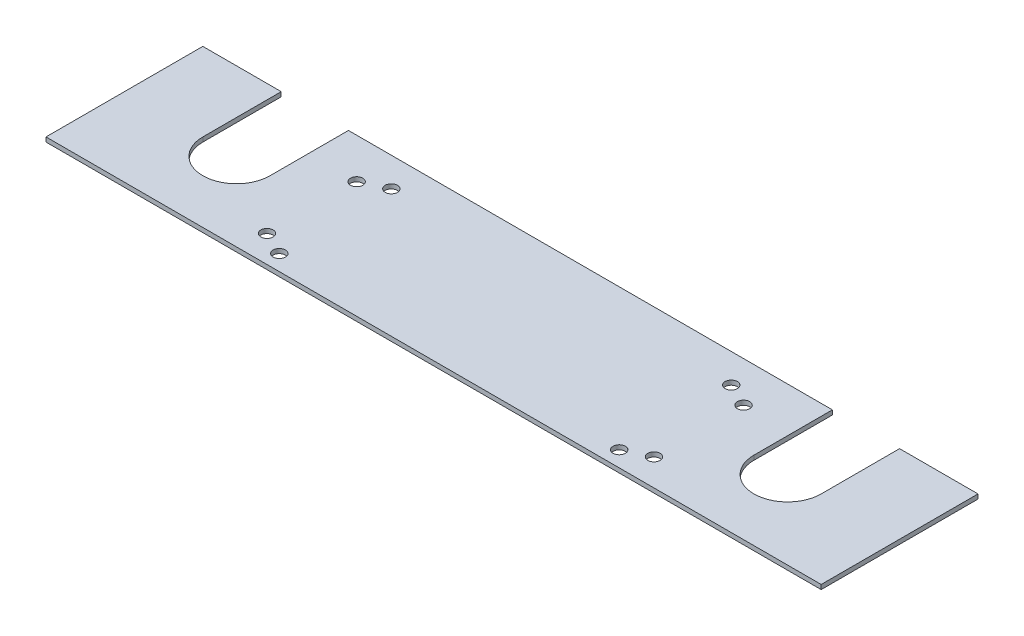
ISO-10303-21;
HEADER;
FILE_DESCRIPTION(('STEP AP214'),'2;1');
FILE_NAME('part.step','',(''),(''),'','','');
FILE_SCHEMA(('AUTOMOTIVE_DESIGN { 1 0 10303 214 1 1 1 1 }'));
ENDSEC;
DATA;
#1=APPLICATION_CONTEXT('core data for automotive mechanical design processes');
#2=APPLICATION_PROTOCOL_DEFINITION('international standard','automotive_design',2000,#1);
#3=PRODUCT_CONTEXT('',#1,'mechanical');
#4=PRODUCT('Part','Part','',(#3));
#5=PRODUCT_RELATED_PRODUCT_CATEGORY('part','',(#4));
#6=PRODUCT_DEFINITION_FORMATION('','',#4);
#7=PRODUCT_DEFINITION_CONTEXT('part definition',#1,'design');
#8=PRODUCT_DEFINITION('design','',#6,#7);
#9=PRODUCT_DEFINITION_SHAPE('','',#8);
#10=(LENGTH_UNIT() NAMED_UNIT(*) SI_UNIT(.MILLI.,.METRE.));
#11=(NAMED_UNIT(*) PLANE_ANGLE_UNIT() SI_UNIT($,.RADIAN.));
#12=(NAMED_UNIT(*) SI_UNIT($,.STERADIAN.) SOLID_ANGLE_UNIT());
#13=UNCERTAINTY_MEASURE_WITH_UNIT(LENGTH_MEASURE(1.E-05),#10,'distance_accuracy_value','');
#14=(GEOMETRIC_REPRESENTATION_CONTEXT(3) GLOBAL_UNCERTAINTY_ASSIGNED_CONTEXT((#13)) GLOBAL_UNIT_ASSIGNED_CONTEXT((#10,
#11,#12)) REPRESENTATION_CONTEXT('',''));
#15=CARTESIAN_POINT('',(0.,0.,0.));
#16=DIRECTION('',(0.,0.,1.));
#17=DIRECTION('',(1.,0.,0.));
#18=AXIS2_PLACEMENT_3D('',#15,#16,#17);
#19=CARTESIAN_POINT('',(0.,0.,0.));
#20=DIRECTION('',(0.,0.,1.));
#21=DIRECTION('',(1.,0.,0.));
#22=AXIS2_PLACEMENT_3D('',#19,#20,#21);
#23=PLANE('',#22);
#24=DIRECTION('',(-1.,0.,0.));
#25=VECTOR('',#24,1.);
#26=CARTESIAN_POINT('',(173.,1.00000000000002,0.));
#27=LINE('',#26,#25);
#28=CARTESIAN_POINT('',(-138.,0.999999999999986,0.));
#29=VERTEX_POINT('',#28);
#30=CARTESIAN_POINT('',(-173.,0.999999999999982,0.));
#31=VERTEX_POINT('',#30);
#32=EDGE_CURVE('E240',#29,#31,#27,.T.);
#33=ORIENTED_EDGE('',*,*,#32,.F.);
#34=DIRECTION('',(0.,-1.,0.));
#35=VECTOR('',#34,1.);
#36=CARTESIAN_POINT('',(-138.,0.,0.));
#37=LINE('',#36,#35);
#38=CARTESIAN_POINT('',(-138.,-1.00000000000002,0.));
#39=VERTEX_POINT('',#38);
#40=EDGE_CURVE('E261',#29,#39,#37,.T.);
#41=ORIENTED_EDGE('',*,*,#40,.T.);
#42=DIRECTION('',(1.,0.,0.));
#43=VECTOR('',#42,1.);
#44=CARTESIAN_POINT('',(173.,-0.999999999999978,0.));
#45=LINE('',#44,#43);
#46=CARTESIAN_POINT('',(-173.,-1.00000000000002,0.));
#47=VERTEX_POINT('',#46);
#48=EDGE_CURVE('E234',#47,#39,#45,.T.);
#49=ORIENTED_EDGE('',*,*,#48,.F.);
#50=DIRECTION('',(0.,-1.,0.));
#51=VECTOR('',#50,1.);
#52=CARTESIAN_POINT('',(-173.,-1.00000000000002,0.));
#53=LINE('',#52,#51);
#54=EDGE_CURVE('E219',#31,#47,#53,.T.);
#55=ORIENTED_EDGE('',*,*,#54,.F.);
#56=EDGE_LOOP('',(#33,#41,#49,#55));
#57=FACE_BOUND('',#56,.T.);
#58=ADVANCED_FACE('F36',(#57),#23,.F.);
#59=CARTESIAN_POINT('',(-108.,-1.00000000000002,0.));
#60=VERTEX_POINT('',#59);
#61=CARTESIAN_POINT('',(108.,-1.00000000000002,0.));
#62=VERTEX_POINT('',#61);
#63=EDGE_CURVE('E238',#60,#62,#45,.T.);
#64=ORIENTED_EDGE('',*,*,#63,.F.);
#65=DIRECTION('',(0.,1.,0.));
#66=VECTOR('',#65,1.);
#67=CARTESIAN_POINT('',(-108.,0.,0.));
#68=LINE('',#67,#66);
#69=CARTESIAN_POINT('',(-108.,0.99999999999999,0.));
#70=VERTEX_POINT('',#69);
#71=EDGE_CURVE('E259',#60,#70,#68,.T.);
#72=ORIENTED_EDGE('',*,*,#71,.T.);
#73=CARTESIAN_POINT('',(108.,1.00000000000002,0.));
#74=VERTEX_POINT('',#73);
#75=EDGE_CURVE('E146',#74,#70,#27,.T.);
#76=ORIENTED_EDGE('',*,*,#75,.F.);
#77=DIRECTION('',(0.,-1.,0.));
#78=VECTOR('',#77,1.);
#79=CARTESIAN_POINT('',(108.,0.,0.));
#80=LINE('',#79,#78);
#81=EDGE_CURVE('E256',#74,#62,#80,.T.);
#82=ORIENTED_EDGE('',*,*,#81,.T.);
#83=EDGE_LOOP('',(#64,#72,#76,#82));
#84=FACE_BOUND('',#83,.T.);
#85=ADVANCED_FACE('F293',(#84),#23,.F.);
#86=CARTESIAN_POINT('',(173.,1.00000000000002,70.));
#87=DIRECTION('',(0.,-1.,0.));
#88=DIRECTION('',(1.,0.,0.));
#89=AXIS2_PLACEMENT_3D('',#86,#87,#88);
#90=PLANE('',#89);
#91=CARTESIAN_POINT('',(-86.3599999999997,1.00000000000001,18.));
#92=DIRECTION('',(0.,1.,0.));
#93=DIRECTION('',(0.,0.,1.));
#94=AXIS2_PLACEMENT_3D('',#91,#92,#93);
#95=CIRCLE('',#94,2.75);
#96=CARTESIAN_POINT('',(-86.3599999999997,1.00000000000001,20.75));
#97=VERTEX_POINT('',#96);
#98=EDGE_CURVE('E171',#97,#97,#95,.T.);
#99=ORIENTED_EDGE('',*,*,#98,.F.);
#100=EDGE_LOOP('',(#99));
#101=FACE_BOUND('',#100,.T.);
#102=CARTESIAN_POINT('',(-75.8599999999997,1.00000000000001,13.));
#103=DIRECTION('',(0.,1.,0.));
#104=DIRECTION('',(0.,0.,1.));
#105=AXIS2_PLACEMENT_3D('',#102,#103,#104);
#106=CIRCLE('',#105,2.75);
#107=CARTESIAN_POINT('',(-75.8599999999997,1.00000000000001,15.75));
#108=VERTEX_POINT('',#107);
#109=EDGE_CURVE('E177',#108,#108,#106,.T.);
#110=ORIENTED_EDGE('',*,*,#109,.F.);
#111=EDGE_LOOP('',(#110));
#112=FACE_BOUND('',#111,.T.);
#113=CARTESIAN_POINT('',(-86.3599999999997,1.00000000000001,58.));
#114=DIRECTION('',(0.,1.,0.));
#115=DIRECTION('',(0.,0.,1.));
#116=AXIS2_PLACEMENT_3D('',#113,#114,#115);
#117=CIRCLE('',#116,2.75);
#118=CARTESIAN_POINT('',(-86.3599999999997,1.00000000000001,60.75));
#119=VERTEX_POINT('',#118);
#120=EDGE_CURVE('E183',#119,#119,#117,.T.);
#121=ORIENTED_EDGE('',*,*,#120,.F.);
#122=EDGE_LOOP('',(#121));
#123=FACE_BOUND('',#122,.T.);
#124=CARTESIAN_POINT('',(86.3599999999997,1.00000000000001,18.));
#125=DIRECTION('',(0.,1.,0.));
#126=DIRECTION('',(0.,0.,1.));
#127=AXIS2_PLACEMENT_3D('',#124,#125,#126);
#128=CIRCLE('',#127,2.75);
#129=CARTESIAN_POINT('',(86.3599999999997,1.00000000000001,20.75));
#130=VERTEX_POINT('',#129);
#131=EDGE_CURVE('E195',#130,#130,#128,.T.);
#132=ORIENTED_EDGE('',*,*,#131,.F.);
#133=EDGE_LOOP('',(#132));
#134=FACE_BOUND('',#133,.T.);
#135=CARTESIAN_POINT('',(75.8599999999997,1.00000000000001,13.));
#136=DIRECTION('',(0.,1.,0.));
#137=DIRECTION('',(0.,0.,1.));
#138=AXIS2_PLACEMENT_3D('',#135,#136,#137);
#139=CIRCLE('',#138,2.75);
#140=CARTESIAN_POINT('',(75.8599999999997,1.00000000000001,15.75));
#141=VERTEX_POINT('',#140);
#142=EDGE_CURVE('E201',#141,#141,#139,.T.);
#143=ORIENTED_EDGE('',*,*,#142,.F.);
#144=EDGE_LOOP('',(#143));
#145=FACE_BOUND('',#144,.T.);
#146=CARTESIAN_POINT('',(86.3599999999997,1.00000000000001,58.));
#147=DIRECTION('',(0.,1.,0.));
#148=DIRECTION('',(0.,0.,1.));
#149=AXIS2_PLACEMENT_3D('',#146,#147,#148);
#150=CIRCLE('',#149,2.75);
#151=CARTESIAN_POINT('',(86.3599999999997,1.00000000000001,60.75));
#152=VERTEX_POINT('',#151);
#153=EDGE_CURVE('E207',#152,#152,#150,.T.);
#154=ORIENTED_EDGE('',*,*,#153,.F.);
#155=EDGE_LOOP('',(#154));
#156=FACE_BOUND('',#155,.T.);
#157=CARTESIAN_POINT('',(75.8599999999997,1.00000000000001,63.));
#158=DIRECTION('',(0.,1.,0.));
#159=DIRECTION('',(0.,0.,1.));
#160=AXIS2_PLACEMENT_3D('',#157,#158,#159);
#161=CIRCLE('',#160,2.75);
#162=CARTESIAN_POINT('',(75.8599999999997,1.00000000000001,65.75));
#163=VERTEX_POINT('',#162);
#164=EDGE_CURVE('E213',#163,#163,#161,.T.);
#165=ORIENTED_EDGE('',*,*,#164,.F.);
#166=EDGE_LOOP('',(#165));
#167=FACE_BOUND('',#166,.T.);
#168=CARTESIAN_POINT('',(-123.,0.999999999999988,35.));
#169=DIRECTION('',(0.,1.,0.));
#170=DIRECTION('',(1.,0.,0.));
#171=AXIS2_PLACEMENT_3D('',#168,#169,#170);
#172=CIRCLE('',#171,15.);
#173=CARTESIAN_POINT('',(-138.,0.999999999999986,35.));
#174=VERTEX_POINT('',#173);
#175=CARTESIAN_POINT('',(-108.,0.99999999999999,35.));
#176=VERTEX_POINT('',#175);
#177=EDGE_CURVE('E133',#174,#176,#172,.T.);
#178=ORIENTED_EDGE('',*,*,#177,.F.);
#179=DIRECTION('',(0.,0.,1.));
#180=VECTOR('',#179,1.);
#181=CARTESIAN_POINT('',(-138.,0.999999999999986,35.));
#182=LINE('',#181,#180);
#183=EDGE_CURVE('E130',#29,#174,#182,.T.);
#184=ORIENTED_EDGE('',*,*,#183,.F.);
#185=ORIENTED_EDGE('',*,*,#32,.T.);
#186=DIRECTION('',(0.,0.,-1.));
#187=VECTOR('',#186,1.);
#188=CARTESIAN_POINT('',(-173.,0.999999999999982,70.));
#189=LINE('',#188,#187);
#190=CARTESIAN_POINT('',(-173.,0.999999999999982,70.));
#191=VERTEX_POINT('',#190);
#192=EDGE_CURVE('E230',#191,#31,#189,.T.);
#193=ORIENTED_EDGE('',*,*,#192,.F.);
#194=DIRECTION('',(-1.,0.,0.));
#195=VECTOR('',#194,1.);
#196=CARTESIAN_POINT('',(173.,1.00000000000002,70.));
#197=LINE('',#196,#195);
#198=CARTESIAN_POINT('',(173.,1.00000000000002,70.));
#199=VERTEX_POINT('',#198);
#200=EDGE_CURVE('E228',#199,#191,#197,.T.);
#201=ORIENTED_EDGE('',*,*,#200,.F.);
#202=DIRECTION('',(0.,0.,-1.));
#203=VECTOR('',#202,1.);
#204=CARTESIAN_POINT('',(173.,1.00000000000002,70.));
#205=LINE('',#204,#203);
#206=CARTESIAN_POINT('',(173.,1.00000000000002,0.));
#207=VERTEX_POINT('',#206);
#208=EDGE_CURVE('E245',#199,#207,#205,.T.);
#209=ORIENTED_EDGE('',*,*,#208,.T.);
#210=CARTESIAN_POINT('',(138.,1.00000000000002,0.));
#211=VERTEX_POINT('',#210);
#212=EDGE_CURVE('E224',#207,#211,#27,.T.);
#213=ORIENTED_EDGE('',*,*,#212,.T.);
#214=DIRECTION('',(0.,0.,-1.));
#215=VECTOR('',#214,1.);
#216=CARTESIAN_POINT('',(138.,1.00000000000002,35.));
#217=LINE('',#216,#215);
#218=CARTESIAN_POINT('',(138.,1.00000000000002,35.));
#219=VERTEX_POINT('',#218);
#220=EDGE_CURVE('E59',#219,#211,#217,.T.);
#221=ORIENTED_EDGE('',*,*,#220,.F.);
#222=CARTESIAN_POINT('',(123.,1.00000000000002,35.));
#223=DIRECTION('',(0.,1.,0.));
#224=DIRECTION('',(-1.,0.,0.));
#225=AXIS2_PLACEMENT_3D('',#222,#223,#224);
#226=CIRCLE('',#225,15.);
#227=CARTESIAN_POINT('',(108.,1.00000000000002,35.));
#228=VERTEX_POINT('',#227);
#229=EDGE_CURVE('E152',#228,#219,#226,.T.);
#230=ORIENTED_EDGE('',*,*,#229,.F.);
#231=DIRECTION('',(0.,0.,1.));
#232=VECTOR('',#231,1.);
#233=CARTESIAN_POINT('',(108.,1.00000000000002,35.));
#234=LINE('',#233,#232);
#235=EDGE_CURVE('E156',#74,#228,#234,.T.);
#236=ORIENTED_EDGE('',*,*,#235,.F.);
#237=ORIENTED_EDGE('',*,*,#75,.T.);
#238=DIRECTION('',(0.,0.,-1.));
#239=VECTOR('',#238,1.);
#240=CARTESIAN_POINT('',(-108.,0.99999999999999,35.));
#241=LINE('',#240,#239);
#242=EDGE_CURVE('E51',#176,#70,#241,.T.);
#243=ORIENTED_EDGE('',*,*,#242,.F.);
#244=EDGE_LOOP('',(#178,#184,#185,#193,#201,#209,#213,#221,#230,#236,#237,#243));
#245=FACE_BOUND('',#244,.T.);
#246=CARTESIAN_POINT('',(-75.8599999999997,1.00000000000001,63.));
#247=DIRECTION('',(0.,1.,0.));
#248=DIRECTION('',(0.,0.,1.));
#249=AXIS2_PLACEMENT_3D('',#246,#247,#248);
#250=CIRCLE('',#249,2.75);
#251=CARTESIAN_POINT('',(-75.8599999999997,1.00000000000001,65.75));
#252=VERTEX_POINT('',#251);
#253=EDGE_CURVE('E189',#252,#252,#250,.T.);
#254=ORIENTED_EDGE('',*,*,#253,.F.);
#255=EDGE_LOOP('',(#254));
#256=FACE_BOUND('',#255,.T.);
#257=ADVANCED_FACE('F142',(#101,#112,#123,#134,#145,#156,#167,#245,#256),#90,.F.);
#258=CARTESIAN_POINT('',(-173.,-1.00000000000002,70.));
#259=DIRECTION('',(1.,0.,0.));
#260=DIRECTION('',(0.,0.,-1.));
#261=AXIS2_PLACEMENT_3D('',#258,#259,#260);
#262=PLANE('',#261);
#263=ORIENTED_EDGE('',*,*,#54,.T.);
#264=DIRECTION('',(0.,0.,-1.));
#265=VECTOR('',#264,1.);
#266=CARTESIAN_POINT('',(-173.,-1.00000000000002,70.));
#267=LINE('',#266,#265);
#268=CARTESIAN_POINT('',(-173.,-1.00000000000002,70.));
#269=VERTEX_POINT('',#268);
#270=EDGE_CURVE('E251',#269,#47,#267,.T.);
#271=ORIENTED_EDGE('',*,*,#270,.F.);
#272=DIRECTION('',(0.,-1.,0.));
#273=VECTOR('',#272,1.);
#274=CARTESIAN_POINT('',(-173.,-1.00000000000002,70.));
#275=LINE('',#274,#273);
#276=EDGE_CURVE('E220',#191,#269,#275,.T.);
#277=ORIENTED_EDGE('',*,*,#276,.F.);
#278=ORIENTED_EDGE('',*,*,#192,.T.);
#279=EDGE_LOOP('',(#263,#271,#277,#278));
#280=FACE_BOUND('',#279,.T.);
#281=ADVANCED_FACE('F38',(#280),#262,.F.);
#282=CARTESIAN_POINT('',(173.,-0.999999999999978,70.));
#283=DIRECTION('',(0.,1.,0.));
#284=DIRECTION('',(-1.,0.,0.));
#285=AXIS2_PLACEMENT_3D('',#282,#283,#284);
#286=PLANE('',#285);
#287=CARTESIAN_POINT('',(-86.3599999999997,-1.00000000000003,18.));
#288=DIRECTION('',(0.,1.,0.));
#289=DIRECTION('',(0.,0.,1.));
#290=AXIS2_PLACEMENT_3D('',#287,#288,#289);
#291=CIRCLE('',#290,2.75);
#292=CARTESIAN_POINT('',(-86.3599999999997,-1.00000000000003,20.75));
#293=VERTEX_POINT('',#292);
#294=EDGE_CURVE('E174',#293,#293,#291,.T.);
#295=ORIENTED_EDGE('',*,*,#294,.T.);
#296=EDGE_LOOP('',(#295));
#297=FACE_BOUND('',#296,.T.);
#298=CARTESIAN_POINT('',(-75.8599999999997,-1.00000000000003,13.));
#299=DIRECTION('',(0.,1.,0.));
#300=DIRECTION('',(0.,0.,1.));
#301=AXIS2_PLACEMENT_3D('',#298,#299,#300);
#302=CIRCLE('',#301,2.75);
#303=CARTESIAN_POINT('',(-75.8599999999997,-1.00000000000003,15.75));
#304=VERTEX_POINT('',#303);
#305=EDGE_CURVE('E180',#304,#304,#302,.T.);
#306=ORIENTED_EDGE('',*,*,#305,.T.);
#307=EDGE_LOOP('',(#306));
#308=FACE_BOUND('',#307,.T.);
#309=CARTESIAN_POINT('',(-86.3599999999997,-1.00000000000003,58.));
#310=DIRECTION('',(0.,1.,0.));
#311=DIRECTION('',(0.,0.,1.));
#312=AXIS2_PLACEMENT_3D('',#309,#310,#311);
#313=CIRCLE('',#312,2.75);
#314=CARTESIAN_POINT('',(-86.3599999999997,-1.00000000000003,60.75));
#315=VERTEX_POINT('',#314);
#316=EDGE_CURVE('E186',#315,#315,#313,.T.);
#317=ORIENTED_EDGE('',*,*,#316,.T.);
#318=EDGE_LOOP('',(#317));
#319=FACE_BOUND('',#318,.T.);
#320=CARTESIAN_POINT('',(-75.8599999999997,-1.00000000000003,63.));
#321=DIRECTION('',(0.,1.,0.));
#322=DIRECTION('',(0.,0.,1.));
#323=AXIS2_PLACEMENT_3D('',#320,#321,#322);
#324=CIRCLE('',#323,2.75);
#325=CARTESIAN_POINT('',(-75.8599999999997,-1.00000000000003,65.75));
#326=VERTEX_POINT('',#325);
#327=EDGE_CURVE('E192',#326,#326,#324,.T.);
#328=ORIENTED_EDGE('',*,*,#327,.T.);
#329=EDGE_LOOP('',(#328));
#330=FACE_BOUND('',#329,.T.);
#331=CARTESIAN_POINT('',(86.3599999999997,-1.00000000000003,18.));
#332=DIRECTION('',(0.,1.,0.));
#333=DIRECTION('',(0.,0.,1.));
#334=AXIS2_PLACEMENT_3D('',#331,#332,#333);
#335=CIRCLE('',#334,2.75);
#336=CARTESIAN_POINT('',(86.3599999999997,-1.00000000000003,20.75));
#337=VERTEX_POINT('',#336);
#338=EDGE_CURVE('E198',#337,#337,#335,.T.);
#339=ORIENTED_EDGE('',*,*,#338,.T.);
#340=EDGE_LOOP('',(#339));
#341=FACE_BOUND('',#340,.T.);
#342=CARTESIAN_POINT('',(75.8599999999997,-1.00000000000003,13.));
#343=DIRECTION('',(0.,1.,0.));
#344=DIRECTION('',(0.,0.,1.));
#345=AXIS2_PLACEMENT_3D('',#342,#343,#344);
#346=CIRCLE('',#345,2.75);
#347=CARTESIAN_POINT('',(75.8599999999997,-1.00000000000003,15.75));
#348=VERTEX_POINT('',#347);
#349=EDGE_CURVE('E204',#348,#348,#346,.T.);
#350=ORIENTED_EDGE('',*,*,#349,.T.);
#351=EDGE_LOOP('',(#350));
#352=FACE_BOUND('',#351,.T.);
#353=CARTESIAN_POINT('',(86.3599999999997,-1.00000000000003,58.));
#354=DIRECTION('',(0.,1.,0.));
#355=DIRECTION('',(0.,0.,1.));
#356=AXIS2_PLACEMENT_3D('',#353,#354,#355);
#357=CIRCLE('',#356,2.75);
#358=CARTESIAN_POINT('',(86.3599999999997,-1.00000000000003,60.75));
#359=VERTEX_POINT('',#358);
#360=EDGE_CURVE('E210',#359,#359,#357,.T.);
#361=ORIENTED_EDGE('',*,*,#360,.T.);
#362=EDGE_LOOP('',(#361));
#363=FACE_BOUND('',#362,.T.);
#364=CARTESIAN_POINT('',(75.8599999999997,-1.00000000000003,63.));
#365=DIRECTION('',(0.,1.,0.));
#366=DIRECTION('',(0.,0.,1.));
#367=AXIS2_PLACEMENT_3D('',#364,#365,#366);
#368=CIRCLE('',#367,2.75);
#369=CARTESIAN_POINT('',(75.8599999999997,-1.00000000000003,65.75));
#370=VERTEX_POINT('',#369);
#371=EDGE_CURVE('E216',#370,#370,#368,.T.);
#372=ORIENTED_EDGE('',*,*,#371,.T.);
#373=EDGE_LOOP('',(#372));
#374=FACE_BOUND('',#373,.T.);
#375=ORIENTED_EDGE('',*,*,#48,.T.);
#376=DIRECTION('',(0.,0.,1.));
#377=VECTOR('',#376,1.);
#378=CARTESIAN_POINT('',(-138.,-1.00000000000002,70.));
#379=LINE('',#378,#377);
#380=CARTESIAN_POINT('',(-138.,-1.00000000000002,35.));
#381=VERTEX_POINT('',#380);
#382=EDGE_CURVE('E168',#39,#381,#379,.T.);
#383=ORIENTED_EDGE('',*,*,#382,.T.);
#384=CARTESIAN_POINT('',(-123.,-1.00000000000001,35.));
#385=DIRECTION('',(0.,1.,0.));
#386=DIRECTION('',(-1.,0.,0.));
#387=AXIS2_PLACEMENT_3D('',#384,#385,#386);
#388=CIRCLE('',#387,15.);
#389=CARTESIAN_POINT('',(-108.,-1.00000000000001,35.));
#390=VERTEX_POINT('',#389);
#391=EDGE_CURVE('E11',#381,#390,#388,.T.);
#392=ORIENTED_EDGE('',*,*,#391,.T.);
#393=DIRECTION('',(0.,0.,-1.));
#394=VECTOR('',#393,1.);
#395=CARTESIAN_POINT('',(-108.,-1.00000000000001,70.));
#396=LINE('',#395,#394);
#397=EDGE_CURVE('E127',#390,#60,#396,.T.);
#398=ORIENTED_EDGE('',*,*,#397,.T.);
#399=ORIENTED_EDGE('',*,*,#63,.T.);
#400=DIRECTION('',(0.,0.,1.));
#401=VECTOR('',#400,1.);
#402=CARTESIAN_POINT('',(108.,-0.999999999999986,70.));
#403=LINE('',#402,#401);
#404=CARTESIAN_POINT('',(108.,-0.999999999999987,35.));
#405=VERTEX_POINT('',#404);
#406=EDGE_CURVE('E164',#62,#405,#403,.T.);
#407=ORIENTED_EDGE('',*,*,#406,.T.);
#408=CARTESIAN_POINT('',(123.,-0.999999999999984,35.));
#409=DIRECTION('',(0.,1.,0.));
#410=DIRECTION('',(-1.,0.,0.));
#411=AXIS2_PLACEMENT_3D('',#408,#409,#410);
#412=CIRCLE('',#411,15.);
#413=CARTESIAN_POINT('',(138.,-0.999999999999982,35.));
#414=VERTEX_POINT('',#413);
#415=EDGE_CURVE('E44',#405,#414,#412,.T.);
#416=ORIENTED_EDGE('',*,*,#415,.T.);
#417=DIRECTION('',(0.,0.,-1.));
#418=VECTOR('',#417,1.);
#419=CARTESIAN_POINT('',(138.,-0.999999999999982,70.));
#420=LINE('',#419,#418);
#421=CARTESIAN_POINT('',(138.,-1.00000000000002,0.));
#422=VERTEX_POINT('',#421);
#423=EDGE_CURVE('E150',#414,#422,#420,.T.);
#424=ORIENTED_EDGE('',*,*,#423,.T.);
#425=CARTESIAN_POINT('',(173.,-0.999999999999978,0.));
#426=VERTEX_POINT('',#425);
#427=EDGE_CURVE('E233',#422,#426,#45,.T.);
#428=ORIENTED_EDGE('',*,*,#427,.T.);
#429=DIRECTION('',(0.,0.,-1.));
#430=VECTOR('',#429,1.);
#431=CARTESIAN_POINT('',(173.,-0.999999999999978,70.));
#432=LINE('',#431,#430);
#433=CARTESIAN_POINT('',(173.,-0.999999999999978,70.));
#434=VERTEX_POINT('',#433);
#435=EDGE_CURVE('E248',#434,#426,#432,.T.);
#436=ORIENTED_EDGE('',*,*,#435,.F.);
#437=DIRECTION('',(1.,0.,0.));
#438=VECTOR('',#437,1.);
#439=CARTESIAN_POINT('',(173.,-0.999999999999978,70.));
#440=LINE('',#439,#438);
#441=EDGE_CURVE('E223',#269,#434,#440,.T.);
#442=ORIENTED_EDGE('',*,*,#441,.F.);
#443=ORIENTED_EDGE('',*,*,#270,.T.);
#444=EDGE_LOOP('',(#375,#383,#392,#398,#399,#407,#416,#424,#428,#436,#442,#443));
#445=FACE_BOUND('',#444,.T.);
#446=ADVANCED_FACE('F265',(#297,#308,#319,#330,#341,#352,#363,#374,#445),#286,.F.);
#447=CARTESIAN_POINT('',(173.,-0.999999999999978,70.));
#448=DIRECTION('',(-1.,0.,0.));
#449=DIRECTION('',(0.,0.,1.));
#450=AXIS2_PLACEMENT_3D('',#447,#448,#449);
#451=PLANE('',#450);
#452=DIRECTION('',(0.,1.,0.));
#453=VECTOR('',#452,1.);
#454=CARTESIAN_POINT('',(173.,-0.999999999999978,0.));
#455=LINE('',#454,#453);
#456=EDGE_CURVE('E237',#426,#207,#455,.T.);
#457=ORIENTED_EDGE('',*,*,#456,.T.);
#458=ORIENTED_EDGE('',*,*,#208,.F.);
#459=DIRECTION('',(0.,1.,0.));
#460=VECTOR('',#459,1.);
#461=CARTESIAN_POINT('',(173.,-0.999999999999978,70.));
#462=LINE('',#461,#460);
#463=EDGE_CURVE('E226',#434,#199,#462,.T.);
#464=ORIENTED_EDGE('',*,*,#463,.F.);
#465=ORIENTED_EDGE('',*,*,#435,.T.);
#466=EDGE_LOOP('',(#457,#458,#464,#465));
#467=FACE_BOUND('',#466,.T.);
#468=ADVANCED_FACE('F313',(#467),#451,.F.);
#469=CARTESIAN_POINT('',(0.,0.,70.));
#470=DIRECTION('',(0.,0.,1.));
#471=DIRECTION('',(1.,0.,0.));
#472=AXIS2_PLACEMENT_3D('',#469,#470,#471);
#473=PLANE('',#472);
#474=ORIENTED_EDGE('',*,*,#276,.T.);
#475=ORIENTED_EDGE('',*,*,#441,.T.);
#476=ORIENTED_EDGE('',*,*,#463,.T.);
#477=ORIENTED_EDGE('',*,*,#200,.T.);
#478=EDGE_LOOP('',(#474,#475,#476,#477));
#479=FACE_BOUND('',#478,.T.);
#480=ADVANCED_FACE('F305',(#479),#473,.T.);
#481=ORIENTED_EDGE('',*,*,#427,.F.);
#482=DIRECTION('',(0.,1.,0.));
#483=VECTOR('',#482,1.);
#484=CARTESIAN_POINT('',(138.,0.,0.));
#485=LINE('',#484,#483);
#486=EDGE_CURVE('E254',#422,#211,#485,.T.);
#487=ORIENTED_EDGE('',*,*,#486,.T.);
#488=ORIENTED_EDGE('',*,*,#212,.F.);
#489=ORIENTED_EDGE('',*,*,#456,.F.);
#490=EDGE_LOOP('',(#481,#487,#488,#489));
#491=FACE_BOUND('',#490,.T.);
#492=ADVANCED_FACE('F280',(#491),#23,.F.);
#493=CARTESIAN_POINT('',(75.8599999999997,1.00000000000001,63.));
#494=DIRECTION('',(0.,1.,0.));
#495=DIRECTION('',(0.,0.,1.));
#496=AXIS2_PLACEMENT_3D('',#493,#494,#495);
#497=CYLINDRICAL_SURFACE('',#496,2.75);
#498=ORIENTED_EDGE('',*,*,#371,.F.);
#499=EDGE_LOOP('',(#498));
#500=FACE_BOUND('',#499,.T.);
#501=ORIENTED_EDGE('',*,*,#164,.T.);
#502=EDGE_LOOP('',(#501));
#503=FACE_BOUND('',#502,.T.);
#504=ADVANCED_FACE('F304',(#500,#503),#497,.F.);
#505=CARTESIAN_POINT('',(86.3599999999997,1.00000000000001,58.));
#506=DIRECTION('',(0.,1.,0.));
#507=DIRECTION('',(0.,0.,1.));
#508=AXIS2_PLACEMENT_3D('',#505,#506,#507);
#509=CYLINDRICAL_SURFACE('',#508,2.75);
#510=ORIENTED_EDGE('',*,*,#360,.F.);
#511=EDGE_LOOP('',(#510));
#512=FACE_BOUND('',#511,.T.);
#513=ORIENTED_EDGE('',*,*,#153,.T.);
#514=EDGE_LOOP('',(#513));
#515=FACE_BOUND('',#514,.T.);
#516=ADVANCED_FACE('F310',(#512,#515),#509,.F.);
#517=CARTESIAN_POINT('',(75.8599999999997,1.00000000000001,13.));
#518=DIRECTION('',(0.,1.,0.));
#519=DIRECTION('',(0.,0.,1.));
#520=AXIS2_PLACEMENT_3D('',#517,#518,#519);
#521=CYLINDRICAL_SURFACE('',#520,2.75);
#522=ORIENTED_EDGE('',*,*,#349,.F.);
#523=EDGE_LOOP('',(#522));
#524=FACE_BOUND('',#523,.T.);
#525=ORIENTED_EDGE('',*,*,#142,.T.);
#526=EDGE_LOOP('',(#525));
#527=FACE_BOUND('',#526,.T.);
#528=ADVANCED_FACE('F323',(#524,#527),#521,.F.);
#529=CARTESIAN_POINT('',(86.3599999999997,1.00000000000001,18.));
#530=DIRECTION('',(0.,1.,0.));
#531=DIRECTION('',(0.,0.,1.));
#532=AXIS2_PLACEMENT_3D('',#529,#530,#531);
#533=CYLINDRICAL_SURFACE('',#532,2.75);
#534=ORIENTED_EDGE('',*,*,#338,.F.);
#535=EDGE_LOOP('',(#534));
#536=FACE_BOUND('',#535,.T.);
#537=ORIENTED_EDGE('',*,*,#131,.T.);
#538=EDGE_LOOP('',(#537));
#539=FACE_BOUND('',#538,.T.);
#540=ADVANCED_FACE('F327',(#536,#539),#533,.F.);
#541=CARTESIAN_POINT('',(-75.8599999999997,1.00000000000001,63.));
#542=DIRECTION('',(0.,1.,0.));
#543=DIRECTION('',(0.,0.,1.));
#544=AXIS2_PLACEMENT_3D('',#541,#542,#543);
#545=CYLINDRICAL_SURFACE('',#544,2.75);
#546=ORIENTED_EDGE('',*,*,#327,.F.);
#547=EDGE_LOOP('',(#546));
#548=FACE_BOUND('',#547,.T.);
#549=ORIENTED_EDGE('',*,*,#253,.T.);
#550=EDGE_LOOP('',(#549));
#551=FACE_BOUND('',#550,.T.);
#552=ADVANCED_FACE('F331',(#548,#551),#545,.F.);
#553=CARTESIAN_POINT('',(-86.3599999999997,1.00000000000001,58.));
#554=DIRECTION('',(0.,1.,0.));
#555=DIRECTION('',(0.,0.,1.));
#556=AXIS2_PLACEMENT_3D('',#553,#554,#555);
#557=CYLINDRICAL_SURFACE('',#556,2.75);
#558=ORIENTED_EDGE('',*,*,#316,.F.);
#559=EDGE_LOOP('',(#558));
#560=FACE_BOUND('',#559,.T.);
#561=ORIENTED_EDGE('',*,*,#120,.T.);
#562=EDGE_LOOP('',(#561));
#563=FACE_BOUND('',#562,.T.);
#564=ADVANCED_FACE('F335',(#560,#563),#557,.F.);
#565=CARTESIAN_POINT('',(-75.8599999999997,1.00000000000001,13.));
#566=DIRECTION('',(0.,1.,0.));
#567=DIRECTION('',(0.,0.,1.));
#568=AXIS2_PLACEMENT_3D('',#565,#566,#567);
#569=CYLINDRICAL_SURFACE('',#568,2.75);
#570=ORIENTED_EDGE('',*,*,#305,.F.);
#571=EDGE_LOOP('',(#570));
#572=FACE_BOUND('',#571,.T.);
#573=ORIENTED_EDGE('',*,*,#109,.T.);
#574=EDGE_LOOP('',(#573));
#575=FACE_BOUND('',#574,.T.);
#576=ADVANCED_FACE('F339',(#572,#575),#569,.F.);
#577=CARTESIAN_POINT('',(-86.3599999999997,1.00000000000001,18.));
#578=DIRECTION('',(0.,1.,0.));
#579=DIRECTION('',(0.,0.,1.));
#580=AXIS2_PLACEMENT_3D('',#577,#578,#579);
#581=CYLINDRICAL_SURFACE('',#580,2.75);
#582=ORIENTED_EDGE('',*,*,#294,.F.);
#583=EDGE_LOOP('',(#582));
#584=FACE_BOUND('',#583,.T.);
#585=ORIENTED_EDGE('',*,*,#98,.T.);
#586=EDGE_LOOP('',(#585));
#587=FACE_BOUND('',#586,.T.);
#588=ADVANCED_FACE('F343',(#584,#587),#581,.F.);
#589=CARTESIAN_POINT('',(123.,-8.99999999999998,35.));
#590=DIRECTION('',(0.,1.,0.));
#591=DIRECTION('',(-1.,0.,0.));
#592=AXIS2_PLACEMENT_3D('',#589,#590,#591);
#593=CYLINDRICAL_SURFACE('',#592,15.);
#594=DIRECTION('',(0.,1.,0.));
#595=VECTOR('',#594,1.);
#596=CARTESIAN_POINT('',(108.,-8.99999999999998,35.));
#597=LINE('',#596,#595);
#598=EDGE_CURVE('E139',#405,#228,#597,.T.);
#599=ORIENTED_EDGE('',*,*,#598,.T.);
#600=ORIENTED_EDGE('',*,*,#229,.T.);
#601=DIRECTION('',(0.,1.,0.));
#602=VECTOR('',#601,1.);
#603=CARTESIAN_POINT('',(138.,-8.99999999999998,35.));
#604=LINE('',#603,#602);
#605=EDGE_CURVE('E159',#414,#219,#604,.T.);
#606=ORIENTED_EDGE('',*,*,#605,.F.);
#607=ORIENTED_EDGE('',*,*,#415,.F.);
#608=EDGE_LOOP('',(#599,#600,#606,#607));
#609=FACE_BOUND('',#608,.T.);
#610=ADVANCED_FACE('F271',(#609),#593,.F.);
#611=CARTESIAN_POINT('',(108.,-8.99999999999998,35.));
#612=DIRECTION('',(-1.,0.,0.));
#613=DIRECTION('',(0.,-1.,0.));
#614=AXIS2_PLACEMENT_3D('',#611,#612,#613);
#615=PLANE('',#614);
#616=ORIENTED_EDGE('',*,*,#81,.F.);
#617=ORIENTED_EDGE('',*,*,#235,.T.);
#618=ORIENTED_EDGE('',*,*,#598,.F.);
#619=ORIENTED_EDGE('',*,*,#406,.F.);
#620=EDGE_LOOP('',(#616,#617,#618,#619));
#621=FACE_BOUND('',#620,.T.);
#622=ADVANCED_FACE('F273',(#621),#615,.F.);
#623=CARTESIAN_POINT('',(138.,-8.99999999999998,35.));
#624=DIRECTION('',(1.,0.,0.));
#625=DIRECTION('',(0.,1.,0.));
#626=AXIS2_PLACEMENT_3D('',#623,#624,#625);
#627=PLANE('',#626);
#628=ORIENTED_EDGE('',*,*,#605,.T.);
#629=ORIENTED_EDGE('',*,*,#220,.T.);
#630=ORIENTED_EDGE('',*,*,#486,.F.);
#631=ORIENTED_EDGE('',*,*,#423,.F.);
#632=EDGE_LOOP('',(#628,#629,#630,#631));
#633=FACE_BOUND('',#632,.T.);
#634=ADVANCED_FACE('F281',(#633),#627,.F.);
#635=CARTESIAN_POINT('',(-123.,-9.00000000000001,35.));
#636=DIRECTION('',(0.,1.,0.));
#637=DIRECTION('',(-1.,0.,0.));
#638=AXIS2_PLACEMENT_3D('',#635,#636,#637);
#639=CYLINDRICAL_SURFACE('',#638,15.);
#640=DIRECTION('',(0.,1.,0.));
#641=VECTOR('',#640,1.);
#642=CARTESIAN_POINT('',(-138.,-9.00000000000001,35.));
#643=LINE('',#642,#641);
#644=EDGE_CURVE('E129',#381,#174,#643,.T.);
#645=ORIENTED_EDGE('',*,*,#644,.T.);
#646=ORIENTED_EDGE('',*,*,#177,.T.);
#647=DIRECTION('',(0.,1.,0.));
#648=VECTOR('',#647,1.);
#649=CARTESIAN_POINT('',(-108.,-9.00000000000001,35.));
#650=LINE('',#649,#648);
#651=EDGE_CURVE('E123',#390,#176,#650,.T.);
#652=ORIENTED_EDGE('',*,*,#651,.F.);
#653=ORIENTED_EDGE('',*,*,#391,.F.);
#654=EDGE_LOOP('',(#645,#646,#652,#653));
#655=FACE_BOUND('',#654,.T.);
#656=ADVANCED_FACE('F134',(#655),#639,.F.);
#657=CARTESIAN_POINT('',(-138.,-9.00000000000001,35.));
#658=DIRECTION('',(-1.,0.,0.));
#659=DIRECTION('',(0.,-1.,0.));
#660=AXIS2_PLACEMENT_3D('',#657,#658,#659);
#661=PLANE('',#660);
#662=ORIENTED_EDGE('',*,*,#40,.F.);
#663=ORIENTED_EDGE('',*,*,#183,.T.);
#664=ORIENTED_EDGE('',*,*,#644,.F.);
#665=ORIENTED_EDGE('',*,*,#382,.F.);
#666=EDGE_LOOP('',(#662,#663,#664,#665));
#667=FACE_BOUND('',#666,.T.);
#668=ADVANCED_FACE('F288',(#667),#661,.F.);
#669=CARTESIAN_POINT('',(-108.,-9.00000000000001,35.));
#670=DIRECTION('',(1.,0.,0.));
#671=DIRECTION('',(0.,1.,0.));
#672=AXIS2_PLACEMENT_3D('',#669,#670,#671);
#673=PLANE('',#672);
#674=ORIENTED_EDGE('',*,*,#651,.T.);
#675=ORIENTED_EDGE('',*,*,#242,.T.);
#676=ORIENTED_EDGE('',*,*,#71,.F.);
#677=ORIENTED_EDGE('',*,*,#397,.F.);
#678=EDGE_LOOP('',(#674,#675,#676,#677));
#679=FACE_BOUND('',#678,.T.);
#680=ADVANCED_FACE('F125',(#679),#673,.F.);
#681=CLOSED_SHELL('',(#58,#85,#257,#281,#446,#468,#480,#492,#504,#516,#528,#540,#552,#564,#576,
#588,#610,#622,#634,#656,#668,#680));
#682=MANIFOLD_SOLID_BREP('B2',#681);
#683=ADVANCED_BREP_SHAPE_REPRESENTATION('',(#18,#682),#14);
#684=SHAPE_DEFINITION_REPRESENTATION(#9,#683);
ENDSEC;
END-ISO-10303-21;
